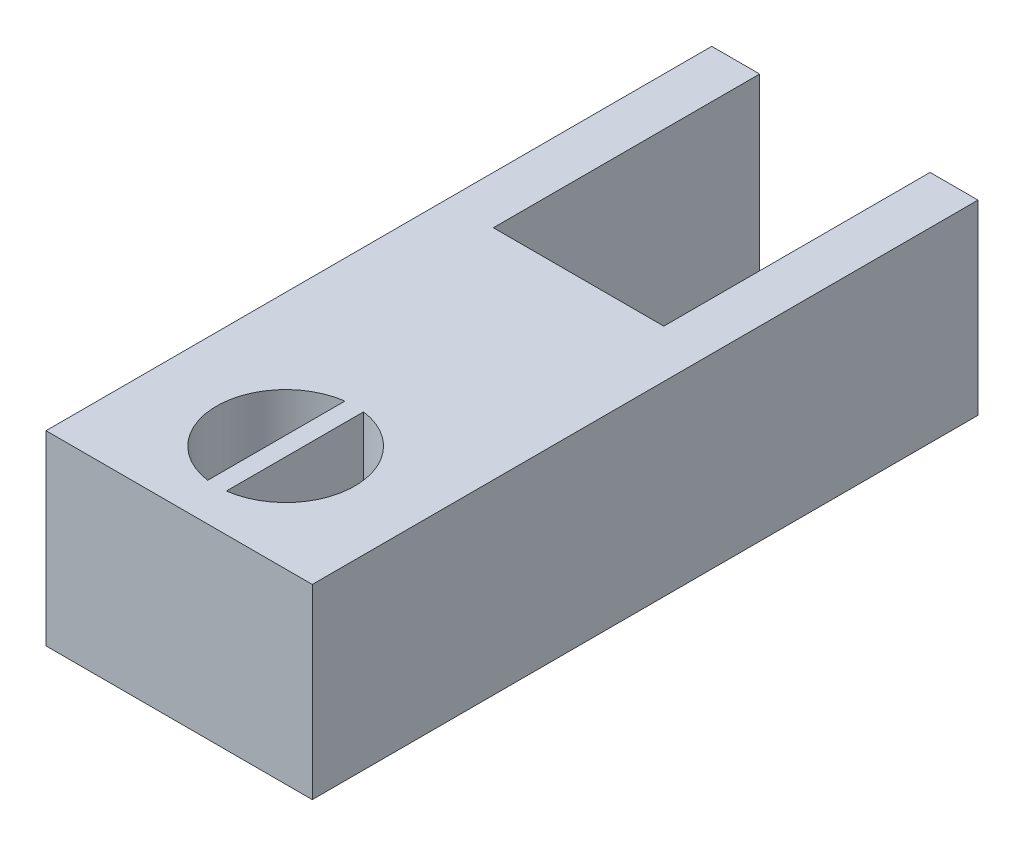
ISO-10303-21;
HEADER;
FILE_DESCRIPTION(('STEP AP214'),'2;1');
FILE_NAME('part.step','',(''),(''),'','','');
FILE_SCHEMA(('AUTOMOTIVE_DESIGN { 1 0 10303 214 1 1 1 1 }'));
ENDSEC;
DATA;
#1=APPLICATION_CONTEXT('core data for automotive mechanical design processes');
#2=APPLICATION_PROTOCOL_DEFINITION('international standard','automotive_design',2000,#1);
#3=PRODUCT_CONTEXT('',#1,'mechanical');
#4=PRODUCT('Part','Part','',(#3));
#5=PRODUCT_RELATED_PRODUCT_CATEGORY('part','',(#4));
#6=PRODUCT_DEFINITION_FORMATION('','',#4);
#7=PRODUCT_DEFINITION_CONTEXT('part definition',#1,'design');
#8=PRODUCT_DEFINITION('design','',#6,#7);
#9=PRODUCT_DEFINITION_SHAPE('','',#8);
#10=(LENGTH_UNIT() NAMED_UNIT(*) SI_UNIT(.MILLI.,.METRE.));
#11=(NAMED_UNIT(*) PLANE_ANGLE_UNIT() SI_UNIT($,.RADIAN.));
#12=(NAMED_UNIT(*) SI_UNIT($,.STERADIAN.) SOLID_ANGLE_UNIT());
#13=UNCERTAINTY_MEASURE_WITH_UNIT(LENGTH_MEASURE(1.E-05),#10,'distance_accuracy_value','');
#14=(GEOMETRIC_REPRESENTATION_CONTEXT(3) GLOBAL_UNCERTAINTY_ASSIGNED_CONTEXT((#13)) GLOBAL_UNIT_ASSIGNED_CONTEXT((#10,
#11,#12)) REPRESENTATION_CONTEXT('',''));
#15=CARTESIAN_POINT('',(0.,0.,0.));
#16=DIRECTION('',(0.,0.,1.));
#17=DIRECTION('',(1.,0.,0.));
#18=AXIS2_PLACEMENT_3D('',#15,#16,#17);
#19=CARTESIAN_POINT('',(0.,8.89,-31.75));
#20=DIRECTION('',(0.,0.,1.));
#21=DIRECTION('',(1.,0.,0.));
#22=AXIS2_PLACEMENT_3D('',#19,#20,#21);
#23=PLANE('',#22);
#24=DIRECTION('',(0.,1.,0.));
#25=VECTOR('',#24,1.);
#26=CARTESIAN_POINT('',(10.414,0.,-31.75));
#27=LINE('',#26,#25);
#28=CARTESIAN_POINT('',(10.414,0.,-31.75));
#29=VERTEX_POINT('',#28);
#30=CARTESIAN_POINT('',(10.414,8.89,-31.75));
#31=VERTEX_POINT('',#30);
#32=EDGE_CURVE('E121',#29,#31,#27,.T.);
#33=ORIENTED_EDGE('',*,*,#32,.T.);
#34=DIRECTION('',(-1.,0.,0.));
#35=VECTOR('',#34,1.);
#36=CARTESIAN_POINT('',(0.,8.89,-31.75));
#37=LINE('',#36,#35);
#38=CARTESIAN_POINT('',(12.7,8.89,-31.75));
#39=VERTEX_POINT('',#38);
#40=EDGE_CURVE('E161',#39,#31,#37,.T.);
#41=ORIENTED_EDGE('',*,*,#40,.F.);
#42=DIRECTION('',(0.,-1.,0.));
#43=VECTOR('',#42,1.);
#44=CARTESIAN_POINT('',(12.7,8.89,-31.75));
#45=LINE('',#44,#43);
#46=CARTESIAN_POINT('',(12.7,0.,-31.75));
#47=VERTEX_POINT('',#46);
#48=EDGE_CURVE('E147',#39,#47,#45,.T.);
#49=ORIENTED_EDGE('',*,*,#48,.T.);
#50=DIRECTION('',(-1.,0.,0.));
#51=VECTOR('',#50,1.);
#52=CARTESIAN_POINT('',(0.,0.,-31.75));
#53=LINE('',#52,#51);
#54=EDGE_CURVE('E140',#47,#29,#53,.T.);
#55=ORIENTED_EDGE('',*,*,#54,.T.);
#56=EDGE_LOOP('',(#33,#41,#49,#55));
#57=FACE_BOUND('',#56,.T.);
#58=ADVANCED_FACE('F33',(#57),#23,.F.);
#59=CARTESIAN_POINT('',(0.,8.89,0.));
#60=DIRECTION('',(0.,-1.,0.));
#61=DIRECTION('',(0.,0.,-1.));
#62=AXIS2_PLACEMENT_3D('',#59,#60,#61);
#63=PLANE('',#62);
#64=DIRECTION('',(0.,0.,1.));
#65=VECTOR('',#64,1.);
#66=CARTESIAN_POINT('',(5.9055,8.89,0.));
#67=LINE('',#66,#65);
#68=CARTESIAN_POINT('',(5.9055,8.89,-8.35194494910901));
#69=VERTEX_POINT('',#68);
#70=CARTESIAN_POINT('',(5.9055,8.89,-1.80805505089098));
#71=VERTEX_POINT('',#70);
#72=EDGE_CURVE('E56',#69,#71,#67,.T.);
#73=ORIENTED_EDGE('',*,*,#72,.T.);
#74=CARTESIAN_POINT('',(6.35,8.89,-5.08));
#75=DIRECTION('',(0.,1.,0.));
#76=DIRECTION('',(0.,0.,1.));
#77=AXIS2_PLACEMENT_3D('',#74,#75,#76);
#78=CIRCLE('',#77,3.302);
#79=EDGE_CURVE('E185',#69,#71,#78,.T.);
#80=ORIENTED_EDGE('',*,*,#79,.F.);
#81=EDGE_LOOP('',(#73,#80));
#82=FACE_BOUND('',#81,.T.);
#83=CARTESIAN_POINT('',(6.35,8.89,-5.08));
#84=DIRECTION('',(0.,1.,0.));
#85=DIRECTION('',(0.,0.,1.));
#86=AXIS2_PLACEMENT_3D('',#83,#84,#85);
#87=CIRCLE('',#86,3.302);
#88=CARTESIAN_POINT('',(6.7945,8.89,-1.80805505089098));
#89=VERTEX_POINT('',#88);
#90=CARTESIAN_POINT('',(6.7945,8.89,-8.35194494910901));
#91=VERTEX_POINT('',#90);
#92=EDGE_CURVE('E199',#89,#91,#87,.T.);
#93=ORIENTED_EDGE('',*,*,#92,.F.);
#94=DIRECTION('',(0.,0.,1.));
#95=VECTOR('',#94,1.);
#96=CARTESIAN_POINT('',(6.7945,8.89,0.));
#97=LINE('',#96,#95);
#98=EDGE_CURVE('E48',#91,#89,#97,.T.);
#99=ORIENTED_EDGE('',*,*,#98,.F.);
#100=EDGE_LOOP('',(#93,#99));
#101=FACE_BOUND('',#100,.T.);
#102=DIRECTION('',(0.,0.,1.));
#103=VECTOR('',#102,1.);
#104=CARTESIAN_POINT('',(10.414,8.89,0.));
#105=LINE('',#104,#103);
#106=CARTESIAN_POINT('',(10.414,8.89,-19.05));
#107=VERTEX_POINT('',#106);
#108=EDGE_CURVE('E127',#31,#107,#105,.T.);
#109=ORIENTED_EDGE('',*,*,#108,.T.);
#110=DIRECTION('',(1.,0.,0.));
#111=VECTOR('',#110,1.);
#112=CARTESIAN_POINT('',(0.,8.89,-19.05));
#113=LINE('',#112,#111);
#114=CARTESIAN_POINT('',(2.286,8.89,-19.05));
#115=VERTEX_POINT('',#114);
#116=EDGE_CURVE('E143',#115,#107,#113,.T.);
#117=ORIENTED_EDGE('',*,*,#116,.F.);
#118=DIRECTION('',(0.,0.,1.));
#119=VECTOR('',#118,1.);
#120=CARTESIAN_POINT('',(2.286,8.89,0.));
#121=LINE('',#120,#119);
#122=CARTESIAN_POINT('',(2.286,8.89,-31.75));
#123=VERTEX_POINT('',#122);
#124=EDGE_CURVE('E214',#123,#115,#121,.T.);
#125=ORIENTED_EDGE('',*,*,#124,.F.);
#126=CARTESIAN_POINT('',(0.,8.89,-31.75));
#127=VERTEX_POINT('',#126);
#128=EDGE_CURVE('E177',#123,#127,#37,.T.);
#129=ORIENTED_EDGE('',*,*,#128,.T.);
#130=DIRECTION('',(0.,0.,1.));
#131=VECTOR('',#130,1.);
#132=CARTESIAN_POINT('',(0.,8.89,0.));
#133=LINE('',#132,#131);
#134=CARTESIAN_POINT('',(0.,8.89,0.));
#135=VERTEX_POINT('',#134);
#136=EDGE_CURVE('E148',#127,#135,#133,.T.);
#137=ORIENTED_EDGE('',*,*,#136,.T.);
#138=DIRECTION('',(1.,0.,0.));
#139=VECTOR('',#138,1.);
#140=CARTESIAN_POINT('',(0.,8.89,0.));
#141=LINE('',#140,#139);
#142=CARTESIAN_POINT('',(12.7,8.89,0.));
#143=VERTEX_POINT('',#142);
#144=EDGE_CURVE('E152',#135,#143,#141,.T.);
#145=ORIENTED_EDGE('',*,*,#144,.T.);
#146=DIRECTION('',(0.,0.,-1.));
#147=VECTOR('',#146,1.);
#148=CARTESIAN_POINT('',(12.7,8.89,0.));
#149=LINE('',#148,#147);
#150=EDGE_CURVE('E167',#143,#39,#149,.T.);
#151=ORIENTED_EDGE('',*,*,#150,.T.);
#152=ORIENTED_EDGE('',*,*,#40,.T.);
#153=EDGE_LOOP('',(#109,#117,#125,#129,#137,#145,#151,#152));
#154=FACE_BOUND('',#153,.T.);
#155=ADVANCED_FACE('F231',(#82,#101,#154),#63,.F.);
#156=CARTESIAN_POINT('',(0.,0.,0.));
#157=DIRECTION('',(0.,-1.,0.));
#158=DIRECTION('',(0.,0.,-1.));
#159=AXIS2_PLACEMENT_3D('',#156,#157,#158);
#160=PLANE('',#159);
#161=DIRECTION('',(0.,0.,1.));
#162=VECTOR('',#161,1.);
#163=CARTESIAN_POINT('',(6.7945,0.,0.));
#164=LINE('',#163,#162);
#165=CARTESIAN_POINT('',(6.7945,0.,-8.35194494910902));
#166=VERTEX_POINT('',#165);
#167=CARTESIAN_POINT('',(6.7945,0.,-1.80805505089098));
#168=VERTEX_POINT('',#167);
#169=EDGE_CURVE('E202',#166,#168,#164,.T.);
#170=ORIENTED_EDGE('',*,*,#169,.T.);
#171=CARTESIAN_POINT('',(6.35,0.,-5.08));
#172=DIRECTION('',(0.,1.,0.));
#173=DIRECTION('',(0.,0.,1.));
#174=AXIS2_PLACEMENT_3D('',#171,#172,#173);
#175=CIRCLE('',#174,3.302);
#176=EDGE_CURVE('E197',#168,#166,#175,.T.);
#177=ORIENTED_EDGE('',*,*,#176,.T.);
#178=EDGE_LOOP('',(#170,#177));
#179=FACE_BOUND('',#178,.T.);
#180=CARTESIAN_POINT('',(6.35,0.,-5.08));
#181=DIRECTION('',(0.,1.,0.));
#182=DIRECTION('',(0.,0.,1.));
#183=AXIS2_PLACEMENT_3D('',#180,#181,#182);
#184=CIRCLE('',#183,3.302);
#185=CARTESIAN_POINT('',(5.9055,0.,-8.35194494910901));
#186=VERTEX_POINT('',#185);
#187=CARTESIAN_POINT('',(5.9055,0.,-1.80805505089098));
#188=VERTEX_POINT('',#187);
#189=EDGE_CURVE('E183',#186,#188,#184,.T.);
#190=ORIENTED_EDGE('',*,*,#189,.T.);
#191=DIRECTION('',(0.,0.,1.));
#192=VECTOR('',#191,1.);
#193=CARTESIAN_POINT('',(5.9055,0.,0.));
#194=LINE('',#193,#192);
#195=EDGE_CURVE('E188',#186,#188,#194,.T.);
#196=ORIENTED_EDGE('',*,*,#195,.F.);
#197=EDGE_LOOP('',(#190,#196));
#198=FACE_BOUND('',#197,.T.);
#199=DIRECTION('',(1.,0.,0.));
#200=VECTOR('',#199,1.);
#201=CARTESIAN_POINT('',(0.,0.,-19.05));
#202=LINE('',#201,#200);
#203=CARTESIAN_POINT('',(2.286,0.,-19.05));
#204=VERTEX_POINT('',#203);
#205=CARTESIAN_POINT('',(10.414,0.,-19.05));
#206=VERTEX_POINT('',#205);
#207=EDGE_CURVE('E133',#204,#206,#202,.T.);
#208=ORIENTED_EDGE('',*,*,#207,.T.);
#209=DIRECTION('',(0.,0.,1.));
#210=VECTOR('',#209,1.);
#211=CARTESIAN_POINT('',(10.414,0.,0.));
#212=LINE('',#211,#210);
#213=EDGE_CURVE('E124',#29,#206,#212,.T.);
#214=ORIENTED_EDGE('',*,*,#213,.F.);
#215=ORIENTED_EDGE('',*,*,#54,.F.);
#216=DIRECTION('',(0.,0.,-1.));
#217=VECTOR('',#216,1.);
#218=CARTESIAN_POINT('',(12.7,0.,0.));
#219=LINE('',#218,#217);
#220=CARTESIAN_POINT('',(12.7,0.,0.));
#221=VERTEX_POINT('',#220);
#222=EDGE_CURVE('E154',#221,#47,#219,.T.);
#223=ORIENTED_EDGE('',*,*,#222,.F.);
#224=DIRECTION('',(1.,0.,0.));
#225=VECTOR('',#224,1.);
#226=CARTESIAN_POINT('',(0.,0.,0.));
#227=LINE('',#226,#225);
#228=CARTESIAN_POINT('',(0.,0.,0.));
#229=VERTEX_POINT('',#228);
#230=EDGE_CURVE('E170',#229,#221,#227,.T.);
#231=ORIENTED_EDGE('',*,*,#230,.F.);
#232=DIRECTION('',(0.,0.,1.));
#233=VECTOR('',#232,1.);
#234=CARTESIAN_POINT('',(0.,0.,0.));
#235=LINE('',#234,#233);
#236=CARTESIAN_POINT('',(0.,0.,-31.75));
#237=VERTEX_POINT('',#236);
#238=EDGE_CURVE('E171',#237,#229,#235,.T.);
#239=ORIENTED_EDGE('',*,*,#238,.F.);
#240=CARTESIAN_POINT('',(2.286,0.,-31.75));
#241=VERTEX_POINT('',#240);
#242=EDGE_CURVE('E149',#241,#237,#53,.T.);
#243=ORIENTED_EDGE('',*,*,#242,.F.);
#244=DIRECTION('',(0.,0.,1.));
#245=VECTOR('',#244,1.);
#246=CARTESIAN_POINT('',(2.286,0.,0.));
#247=LINE('',#246,#245);
#248=EDGE_CURVE('E142',#241,#204,#247,.T.);
#249=ORIENTED_EDGE('',*,*,#248,.T.);
#250=EDGE_LOOP('',(#208,#214,#215,#223,#231,#239,#243,#249));
#251=FACE_BOUND('',#250,.T.);
#252=ADVANCED_FACE('F138',(#179,#198,#251),#160,.T.);
#253=CARTESIAN_POINT('',(0.,8.89,0.));
#254=DIRECTION('',(1.,0.,0.));
#255=DIRECTION('',(0.,0.,-1.));
#256=AXIS2_PLACEMENT_3D('',#253,#254,#255);
#257=PLANE('',#256);
#258=ORIENTED_EDGE('',*,*,#238,.T.);
#259=DIRECTION('',(0.,-1.,0.));
#260=VECTOR('',#259,1.);
#261=CARTESIAN_POINT('',(0.,8.89,0.));
#262=LINE('',#261,#260);
#263=EDGE_CURVE('E11',#135,#229,#262,.T.);
#264=ORIENTED_EDGE('',*,*,#263,.F.);
#265=ORIENTED_EDGE('',*,*,#136,.F.);
#266=DIRECTION('',(0.,-1.,0.));
#267=VECTOR('',#266,1.);
#268=CARTESIAN_POINT('',(0.,8.89,-31.75));
#269=LINE('',#268,#267);
#270=EDGE_CURVE('E158',#127,#237,#269,.T.);
#271=ORIENTED_EDGE('',*,*,#270,.T.);
#272=EDGE_LOOP('',(#258,#264,#265,#271));
#273=FACE_BOUND('',#272,.T.);
#274=ADVANCED_FACE('F35',(#273),#257,.F.);
#275=CARTESIAN_POINT('',(0.,8.89,0.));
#276=DIRECTION('',(0.,0.,-1.));
#277=DIRECTION('',(-1.,0.,0.));
#278=AXIS2_PLACEMENT_3D('',#275,#276,#277);
#279=PLANE('',#278);
#280=ORIENTED_EDGE('',*,*,#230,.T.);
#281=DIRECTION('',(0.,-1.,0.));
#282=VECTOR('',#281,1.);
#283=CARTESIAN_POINT('',(12.7,8.89,0.));
#284=LINE('',#283,#282);
#285=EDGE_CURVE('E41',#143,#221,#284,.T.);
#286=ORIENTED_EDGE('',*,*,#285,.F.);
#287=ORIENTED_EDGE('',*,*,#144,.F.);
#288=ORIENTED_EDGE('',*,*,#263,.T.);
#289=EDGE_LOOP('',(#280,#286,#287,#288));
#290=FACE_BOUND('',#289,.T.);
#291=ADVANCED_FACE('F262',(#290),#279,.F.);
#292=CARTESIAN_POINT('',(12.7,8.89,0.));
#293=DIRECTION('',(-1.,0.,0.));
#294=DIRECTION('',(0.,0.,1.));
#295=AXIS2_PLACEMENT_3D('',#292,#293,#294);
#296=PLANE('',#295);
#297=ORIENTED_EDGE('',*,*,#222,.T.);
#298=ORIENTED_EDGE('',*,*,#48,.F.);
#299=ORIENTED_EDGE('',*,*,#150,.F.);
#300=ORIENTED_EDGE('',*,*,#285,.T.);
#301=EDGE_LOOP('',(#297,#298,#299,#300));
#302=FACE_BOUND('',#301,.T.);
#303=ADVANCED_FACE('F166',(#302),#296,.F.);
#304=ORIENTED_EDGE('',*,*,#128,.F.);
#305=DIRECTION('',(0.,1.,0.));
#306=VECTOR('',#305,1.);
#307=CARTESIAN_POINT('',(2.286,0.,-31.75));
#308=LINE('',#307,#306);
#309=EDGE_CURVE('E132',#241,#123,#308,.T.);
#310=ORIENTED_EDGE('',*,*,#309,.F.);
#311=ORIENTED_EDGE('',*,*,#242,.T.);
#312=ORIENTED_EDGE('',*,*,#270,.F.);
#313=EDGE_LOOP('',(#304,#310,#311,#312));
#314=FACE_BOUND('',#313,.T.);
#315=ADVANCED_FACE('F227',(#314),#23,.F.);
#316=CARTESIAN_POINT('',(5.9055,0.,0.));
#317=DIRECTION('',(-1.,0.,0.));
#318=DIRECTION('',(0.,0.,1.));
#319=AXIS2_PLACEMENT_3D('',#316,#317,#318);
#320=PLANE('',#319);
#321=ORIENTED_EDGE('',*,*,#72,.F.);
#322=DIRECTION('',(0.,1.,0.));
#323=VECTOR('',#322,1.);
#324=CARTESIAN_POINT('',(5.9055,0.,-8.35194494910901));
#325=LINE('',#324,#323);
#326=EDGE_CURVE('E180',#186,#69,#325,.T.);
#327=ORIENTED_EDGE('',*,*,#326,.F.);
#328=ORIENTED_EDGE('',*,*,#195,.T.);
#329=DIRECTION('',(0.,1.,0.));
#330=VECTOR('',#329,1.);
#331=CARTESIAN_POINT('',(5.9055,0.,-1.80805505089098));
#332=LINE('',#331,#330);
#333=EDGE_CURVE('E182',#188,#71,#332,.T.);
#334=ORIENTED_EDGE('',*,*,#333,.T.);
#335=EDGE_LOOP('',(#321,#327,#328,#334));
#336=FACE_BOUND('',#335,.T.);
#337=ADVANCED_FACE('F255',(#336),#320,.T.);
#338=CARTESIAN_POINT('',(6.35,0.,-5.08));
#339=DIRECTION('',(0.,1.,0.));
#340=DIRECTION('',(0.,0.,1.));
#341=AXIS2_PLACEMENT_3D('',#338,#339,#340);
#342=CYLINDRICAL_SURFACE('',#341,3.302);
#343=ORIENTED_EDGE('',*,*,#79,.T.);
#344=ORIENTED_EDGE('',*,*,#333,.F.);
#345=ORIENTED_EDGE('',*,*,#189,.F.);
#346=ORIENTED_EDGE('',*,*,#326,.T.);
#347=EDGE_LOOP('',(#343,#344,#345,#346));
#348=FACE_BOUND('',#347,.T.);
#349=ADVANCED_FACE('F260',(#348),#342,.F.);
#350=CARTESIAN_POINT('',(6.7945,0.,0.));
#351=DIRECTION('',(-1.,0.,0.));
#352=DIRECTION('',(0.,0.,1.));
#353=AXIS2_PLACEMENT_3D('',#350,#351,#352);
#354=PLANE('',#353);
#355=ORIENTED_EDGE('',*,*,#98,.T.);
#356=DIRECTION('',(0.,1.,0.));
#357=VECTOR('',#356,1.);
#358=CARTESIAN_POINT('',(6.7945,0.,-1.80805505089098));
#359=LINE('',#358,#357);
#360=EDGE_CURVE('E194',#168,#89,#359,.T.);
#361=ORIENTED_EDGE('',*,*,#360,.F.);
#362=ORIENTED_EDGE('',*,*,#169,.F.);
#363=DIRECTION('',(0.,1.,0.));
#364=VECTOR('',#363,1.);
#365=CARTESIAN_POINT('',(6.7945,0.,-8.35194494910901));
#366=LINE('',#365,#364);
#367=EDGE_CURVE('E196',#166,#91,#366,.T.);
#368=ORIENTED_EDGE('',*,*,#367,.T.);
#369=EDGE_LOOP('',(#355,#361,#362,#368));
#370=FACE_BOUND('',#369,.T.);
#371=ADVANCED_FACE('F280',(#370),#354,.F.);
#372=CARTESIAN_POINT('',(6.35,0.,-5.08));
#373=DIRECTION('',(0.,1.,0.));
#374=DIRECTION('',(0.,0.,1.));
#375=AXIS2_PLACEMENT_3D('',#372,#373,#374);
#376=CYLINDRICAL_SURFACE('',#375,3.302);
#377=ORIENTED_EDGE('',*,*,#92,.T.);
#378=ORIENTED_EDGE('',*,*,#367,.F.);
#379=ORIENTED_EDGE('',*,*,#176,.F.);
#380=ORIENTED_EDGE('',*,*,#360,.T.);
#381=EDGE_LOOP('',(#377,#378,#379,#380));
#382=FACE_BOUND('',#381,.T.);
#383=ADVANCED_FACE('F243',(#382),#376,.F.);
#384=CARTESIAN_POINT('',(10.414,0.,0.));
#385=DIRECTION('',(-1.,0.,0.));
#386=DIRECTION('',(0.,0.,1.));
#387=AXIS2_PLACEMENT_3D('',#384,#385,#386);
#388=PLANE('',#387);
#389=ORIENTED_EDGE('',*,*,#108,.F.);
#390=ORIENTED_EDGE('',*,*,#32,.F.);
#391=ORIENTED_EDGE('',*,*,#213,.T.);
#392=DIRECTION('',(0.,1.,0.));
#393=VECTOR('',#392,1.);
#394=CARTESIAN_POINT('',(10.414,0.,-19.05));
#395=LINE('',#394,#393);
#396=EDGE_CURVE('E173',#206,#107,#395,.T.);
#397=ORIENTED_EDGE('',*,*,#396,.T.);
#398=EDGE_LOOP('',(#389,#390,#391,#397));
#399=FACE_BOUND('',#398,.T.);
#400=ADVANCED_FACE('F123',(#399),#388,.T.);
#401=CARTESIAN_POINT('',(0.,0.,-19.05));
#402=DIRECTION('',(0.,0.,1.));
#403=DIRECTION('',(1.,0.,0.));
#404=AXIS2_PLACEMENT_3D('',#401,#402,#403);
#405=PLANE('',#404);
#406=ORIENTED_EDGE('',*,*,#116,.T.);
#407=ORIENTED_EDGE('',*,*,#396,.F.);
#408=ORIENTED_EDGE('',*,*,#207,.F.);
#409=DIRECTION('',(0.,1.,0.));
#410=VECTOR('',#409,1.);
#411=CARTESIAN_POINT('',(2.286,0.,-19.05));
#412=LINE('',#411,#410);
#413=EDGE_CURVE('E209',#204,#115,#412,.T.);
#414=ORIENTED_EDGE('',*,*,#413,.T.);
#415=EDGE_LOOP('',(#406,#407,#408,#414));
#416=FACE_BOUND('',#415,.T.);
#417=ADVANCED_FACE('F235',(#416),#405,.F.);
#418=CARTESIAN_POINT('',(2.286,0.,0.));
#419=DIRECTION('',(-1.,0.,0.));
#420=DIRECTION('',(0.,0.,1.));
#421=AXIS2_PLACEMENT_3D('',#418,#419,#420);
#422=PLANE('',#421);
#423=ORIENTED_EDGE('',*,*,#124,.T.);
#424=ORIENTED_EDGE('',*,*,#413,.F.);
#425=ORIENTED_EDGE('',*,*,#248,.F.);
#426=ORIENTED_EDGE('',*,*,#309,.T.);
#427=EDGE_LOOP('',(#423,#424,#425,#426));
#428=FACE_BOUND('',#427,.T.);
#429=ADVANCED_FACE('F223',(#428),#422,.F.);
#430=CLOSED_SHELL('',(#58,#155,#252,#274,#291,#303,#315,#337,#349,#371,#383,#400,#417,#429));
#431=MANIFOLD_SOLID_BREP('B2',#430);
#432=ADVANCED_BREP_SHAPE_REPRESENTATION('',(#18,#431),#14);
#433=SHAPE_DEFINITION_REPRESENTATION(#9,#432);
ENDSEC;
END-ISO-10303-21;
